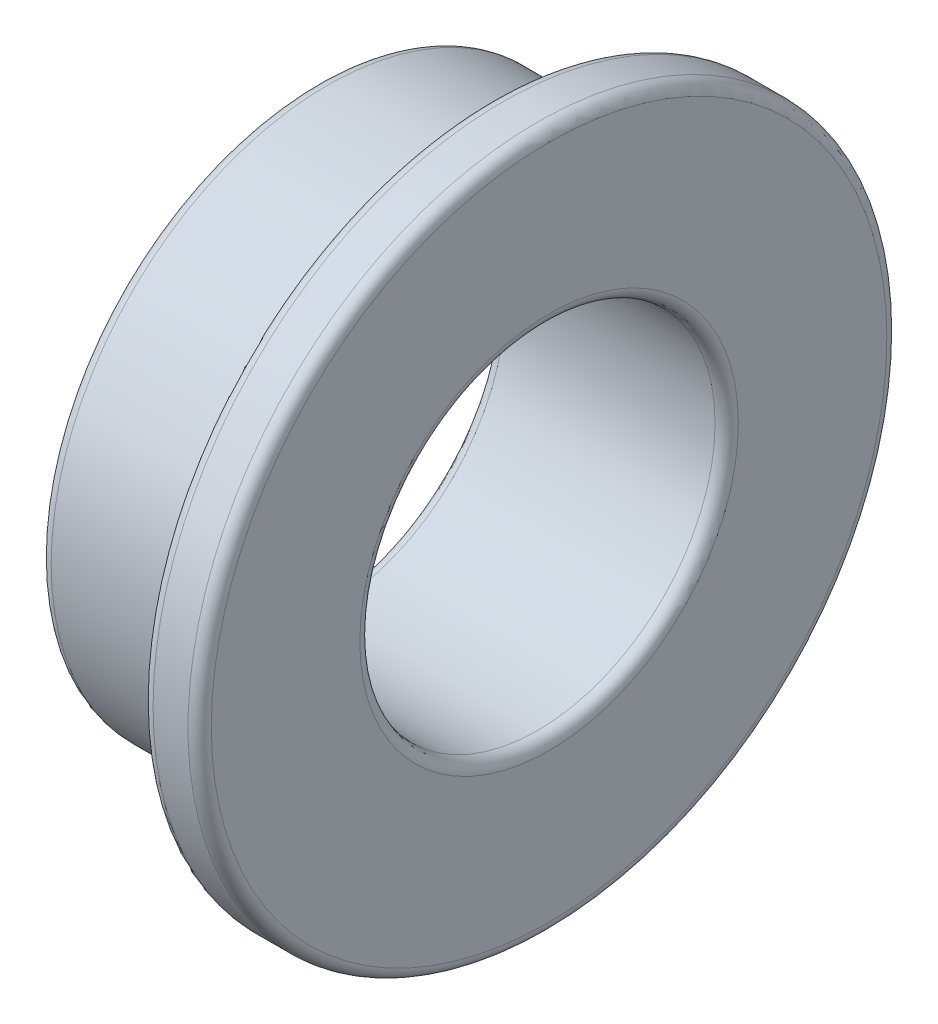
ISO-10303-21;
HEADER;
FILE_DESCRIPTION(('STEP AP214'),'2;1');
FILE_NAME('part.step','',(''),(''),'','','');
FILE_SCHEMA(('AUTOMOTIVE_DESIGN { 1 0 10303 214 1 1 1 1 }'));
ENDSEC;
DATA;
#1=APPLICATION_CONTEXT('core data for automotive mechanical design processes');
#2=APPLICATION_PROTOCOL_DEFINITION('international standard','automotive_design',2000,#1);
#3=PRODUCT_CONTEXT('',#1,'mechanical');
#4=PRODUCT('Part','Part','',(#3));
#5=PRODUCT_RELATED_PRODUCT_CATEGORY('part','',(#4));
#6=PRODUCT_DEFINITION_FORMATION('','',#4);
#7=PRODUCT_DEFINITION_CONTEXT('part definition',#1,'design');
#8=PRODUCT_DEFINITION('design','',#6,#7);
#9=PRODUCT_DEFINITION_SHAPE('','',#8);
#10=(LENGTH_UNIT() NAMED_UNIT(*) SI_UNIT(.MILLI.,.METRE.));
#11=(NAMED_UNIT(*) PLANE_ANGLE_UNIT() SI_UNIT($,.RADIAN.));
#12=(NAMED_UNIT(*) SI_UNIT($,.STERADIAN.) SOLID_ANGLE_UNIT());
#13=UNCERTAINTY_MEASURE_WITH_UNIT(LENGTH_MEASURE(1.E-05),#10,'distance_accuracy_value','');
#14=(GEOMETRIC_REPRESENTATION_CONTEXT(3) GLOBAL_UNCERTAINTY_ASSIGNED_CONTEXT((#13)) GLOBAL_UNIT_ASSIGNED_CONTEXT((#10,
#11,#12)) REPRESENTATION_CONTEXT('',''));
#15=CARTESIAN_POINT('',(0.,0.,0.));
#16=DIRECTION('',(0.,0.,1.));
#17=DIRECTION('',(1.,0.,0.));
#18=AXIS2_PLACEMENT_3D('',#15,#16,#17);
#19=CARTESIAN_POINT('',(-4.,0.,0.));
#20=DIRECTION('',(-1.,0.,0.));
#21=DIRECTION('',(0.,0.,1.));
#22=AXIS2_PLACEMENT_3D('',#19,#20,#21);
#23=PLANE('',#22);
#24=CARTESIAN_POINT('',(-4.,0.,0.));
#25=DIRECTION('',(-1.,0.,0.));
#26=DIRECTION('',(0.,0.,1.));
#27=AXIS2_PLACEMENT_3D('',#24,#25,#26);
#28=CIRCLE('',#27,3.25);
#29=CARTESIAN_POINT('',(-4.,0.,3.25));
#30=VERTEX_POINT('',#29);
#31=EDGE_CURVE('E69',#30,#30,#28,.F.);
#32=ORIENTED_EDGE('',*,*,#31,.T.);
#33=EDGE_LOOP('',(#32));
#34=FACE_BOUND('',#33,.T.);
#35=CARTESIAN_POINT('',(-4.,0.,0.));
#36=DIRECTION('',(-1.,0.,0.));
#37=DIRECTION('',(0.,0.,1.));
#38=AXIS2_PLACEMENT_3D('',#35,#36,#37);
#39=CIRCLE('',#38,4.55);
#40=CARTESIAN_POINT('',(-4.,0.,4.55));
#41=VERTEX_POINT('',#40);
#42=EDGE_CURVE('E73',#41,#41,#39,.T.);
#43=ORIENTED_EDGE('',*,*,#42,.T.);
#44=EDGE_LOOP('',(#43));
#45=FACE_BOUND('',#44,.T.);
#46=ADVANCED_FACE('F37',(#34,#45),#23,.T.);
#47=CARTESIAN_POINT('',(0.,0.,0.));
#48=DIRECTION('',(1.,0.,0.));
#49=DIRECTION('',(0.,0.,-1.));
#50=AXIS2_PLACEMENT_3D('',#47,#48,#49);
#51=CYLINDRICAL_SURFACE('',#50,4.75);
#52=CARTESIAN_POINT('',(-1.2,0.,0.));
#53=DIRECTION('',(-1.,0.,0.));
#54=DIRECTION('',(0.,0.,1.));
#55=AXIS2_PLACEMENT_3D('',#52,#53,#54);
#56=CIRCLE('',#55,4.75);
#57=CARTESIAN_POINT('',(-1.2,0.,4.75));
#58=VERTEX_POINT('',#57);
#59=EDGE_CURVE('E10',#58,#58,#56,.T.);
#60=ORIENTED_EDGE('',*,*,#59,.T.);
#61=EDGE_LOOP('',(#60));
#62=FACE_BOUND('',#61,.T.);
#63=CARTESIAN_POINT('',(-3.8,0.,0.));
#64=DIRECTION('',(-1.,0.,0.));
#65=DIRECTION('',(0.,0.,1.));
#66=AXIS2_PLACEMENT_3D('',#63,#64,#65);
#67=CIRCLE('',#66,4.75);
#68=CARTESIAN_POINT('',(-3.8,0.,4.75));
#69=VERTEX_POINT('',#68);
#70=EDGE_CURVE('E45',#69,#69,#67,.F.);
#71=ORIENTED_EDGE('',*,*,#70,.T.);
#72=EDGE_LOOP('',(#71));
#73=FACE_BOUND('',#72,.T.);
#74=ADVANCED_FACE('F106',(#62,#73),#51,.T.);
#75=CARTESIAN_POINT('',(-1.,4.75,0.));
#76=DIRECTION('',(-1.,0.,0.));
#77=DIRECTION('',(0.,0.,1.));
#78=AXIS2_PLACEMENT_3D('',#75,#76,#77);
#79=PLANE('',#78);
#80=CARTESIAN_POINT('',(-1.,0.,0.));
#81=DIRECTION('',(-1.,0.,0.));
#82=DIRECTION('',(0.,0.,1.));
#83=AXIS2_PLACEMENT_3D('',#80,#81,#82);
#84=CIRCLE('',#83,5.8);
#85=CARTESIAN_POINT('',(-1.,0.,5.8));
#86=VERTEX_POINT('',#85);
#87=EDGE_CURVE('E50',#86,#86,#84,.T.);
#88=ORIENTED_EDGE('',*,*,#87,.T.);
#89=EDGE_LOOP('',(#88));
#90=FACE_BOUND('',#89,.T.);
#91=CARTESIAN_POINT('',(-1.,0.,0.));
#92=DIRECTION('',(-1.,0.,0.));
#93=DIRECTION('',(0.,0.,1.));
#94=AXIS2_PLACEMENT_3D('',#91,#92,#93);
#95=CIRCLE('',#94,4.95);
#96=CARTESIAN_POINT('',(-1.,0.,4.95));
#97=VERTEX_POINT('',#96);
#98=EDGE_CURVE('E55',#97,#97,#95,.F.);
#99=ORIENTED_EDGE('',*,*,#98,.T.);
#100=EDGE_LOOP('',(#99));
#101=FACE_BOUND('',#100,.T.);
#102=ADVANCED_FACE('F133',(#90,#101),#79,.T.);
#103=CARTESIAN_POINT('',(0.,0.,0.));
#104=DIRECTION('',(1.,0.,0.));
#105=DIRECTION('',(0.,0.,-1.));
#106=AXIS2_PLACEMENT_3D('',#103,#104,#105);
#107=CYLINDRICAL_SURFACE('',#106,6.);
#108=CARTESIAN_POINT('',(-0.2,0.,0.));
#109=DIRECTION('',(1.,0.,0.));
#110=DIRECTION('',(0.,0.,-1.));
#111=AXIS2_PLACEMENT_3D('',#108,#109,#110);
#112=CIRCLE('',#111,6.);
#113=CARTESIAN_POINT('',(-0.2,0.,-6.));
#114=VERTEX_POINT('',#113);
#115=EDGE_CURVE('E61',#114,#114,#112,.F.);
#116=ORIENTED_EDGE('',*,*,#115,.T.);
#117=EDGE_LOOP('',(#116));
#118=FACE_BOUND('',#117,.T.);
#119=CARTESIAN_POINT('',(-0.8,0.,0.));
#120=DIRECTION('',(-1.,0.,0.));
#121=DIRECTION('',(0.,0.,1.));
#122=AXIS2_PLACEMENT_3D('',#119,#120,#121);
#123=CIRCLE('',#122,6.);
#124=CARTESIAN_POINT('',(-0.8,0.,6.));
#125=VERTEX_POINT('',#124);
#126=EDGE_CURVE('E65',#125,#125,#123,.F.);
#127=ORIENTED_EDGE('',*,*,#126,.T.);
#128=EDGE_LOOP('',(#127));
#129=FACE_BOUND('',#128,.T.);
#130=ADVANCED_FACE('F136',(#118,#129),#107,.T.);
#131=CARTESIAN_POINT('',(0.,6.,0.));
#132=DIRECTION('',(1.,0.,0.));
#133=DIRECTION('',(0.,0.,-1.));
#134=AXIS2_PLACEMENT_3D('',#131,#132,#133);
#135=PLANE('',#134);
#136=CARTESIAN_POINT('',(0.,0.,0.));
#137=DIRECTION('',(1.,0.,0.));
#138=DIRECTION('',(0.,0.,-1.));
#139=AXIS2_PLACEMENT_3D('',#136,#137,#138);
#140=CIRCLE('',#139,3.25);
#141=CARTESIAN_POINT('',(0.,0.,-3.25));
#142=VERTEX_POINT('',#141);
#143=EDGE_CURVE('E77',#142,#142,#140,.F.);
#144=ORIENTED_EDGE('',*,*,#143,.T.);
#145=EDGE_LOOP('',(#144));
#146=FACE_BOUND('',#145,.T.);
#147=CARTESIAN_POINT('',(0.,0.,0.));
#148=DIRECTION('',(1.,0.,0.));
#149=DIRECTION('',(0.,0.,-1.));
#150=AXIS2_PLACEMENT_3D('',#147,#148,#149);
#151=CIRCLE('',#150,5.8);
#152=CARTESIAN_POINT('',(0.,0.,-5.8));
#153=VERTEX_POINT('',#152);
#154=EDGE_CURVE('E81',#153,#153,#151,.T.);
#155=ORIENTED_EDGE('',*,*,#154,.T.);
#156=EDGE_LOOP('',(#155));
#157=FACE_BOUND('',#156,.T.);
#158=ADVANCED_FACE('F140',(#146,#157),#135,.T.);
#159=CARTESIAN_POINT('',(-4.001,0.,0.));
#160=DIRECTION('',(1.,0.,0.));
#161=DIRECTION('',(0.,0.,-1.));
#162=AXIS2_PLACEMENT_3D('',#159,#160,#161);
#163=CYLINDRICAL_SURFACE('',#162,3.05);
#164=CARTESIAN_POINT('',(-0.200000000000001,0.,0.));
#165=DIRECTION('',(1.,0.,0.));
#166=DIRECTION('',(0.,0.,-1.));
#167=AXIS2_PLACEMENT_3D('',#164,#165,#166);
#168=CIRCLE('',#167,3.05);
#169=CARTESIAN_POINT('',(-0.200000000000001,0.,-3.05));
#170=VERTEX_POINT('',#169);
#171=EDGE_CURVE('E85',#170,#170,#168,.T.);
#172=ORIENTED_EDGE('',*,*,#171,.T.);
#173=EDGE_LOOP('',(#172));
#174=FACE_BOUND('',#173,.T.);
#175=CARTESIAN_POINT('',(-3.8,0.,0.));
#176=DIRECTION('',(-1.,0.,0.));
#177=DIRECTION('',(0.,0.,1.));
#178=AXIS2_PLACEMENT_3D('',#175,#176,#177);
#179=CIRCLE('',#178,3.05);
#180=CARTESIAN_POINT('',(-3.8,0.,3.05));
#181=VERTEX_POINT('',#180);
#182=EDGE_CURVE('E89',#181,#181,#179,.T.);
#183=ORIENTED_EDGE('',*,*,#182,.T.);
#184=EDGE_LOOP('',(#183));
#185=FACE_BOUND('',#184,.T.);
#186=ADVANCED_FACE('F94',(#174,#185),#163,.F.);
#187=CARTESIAN_POINT('',(-0.200000000000001,0.,0.));
#188=DIRECTION('',(1.,0.,0.));
#189=DIRECTION('',(0.,0.,-1.));
#190=AXIS2_PLACEMENT_3D('',#187,#188,#189);
#191=TOROIDAL_SURFACE('',#190,3.25,0.2);
#192=ORIENTED_EDGE('',*,*,#143,.F.);
#193=EDGE_LOOP('',(#192));
#194=FACE_BOUND('',#193,.T.);
#195=ORIENTED_EDGE('',*,*,#171,.F.);
#196=EDGE_LOOP('',(#195));
#197=FACE_BOUND('',#196,.T.);
#198=ADVANCED_FACE('F100',(#194,#197),#191,.T.);
#199=CARTESIAN_POINT('',(-3.8,0.,0.));
#200=DIRECTION('',(-1.,0.,0.));
#201=DIRECTION('',(0.,0.,1.));
#202=AXIS2_PLACEMENT_3D('',#199,#200,#201);
#203=TOROIDAL_SURFACE('',#202,3.25,0.2);
#204=ORIENTED_EDGE('',*,*,#182,.F.);
#205=EDGE_LOOP('',(#204));
#206=FACE_BOUND('',#205,.T.);
#207=ORIENTED_EDGE('',*,*,#31,.F.);
#208=EDGE_LOOP('',(#207));
#209=FACE_BOUND('',#208,.T.);
#210=ADVANCED_FACE('F96',(#206,#209),#203,.T.);
#211=CARTESIAN_POINT('',(-0.2,0.,0.));
#212=DIRECTION('',(1.,0.,0.));
#213=DIRECTION('',(0.,0.,-1.));
#214=AXIS2_PLACEMENT_3D('',#211,#212,#213);
#215=TOROIDAL_SURFACE('',#214,5.8,0.2);
#216=ORIENTED_EDGE('',*,*,#115,.F.);
#217=EDGE_LOOP('',(#216));
#218=FACE_BOUND('',#217,.T.);
#219=ORIENTED_EDGE('',*,*,#154,.F.);
#220=EDGE_LOOP('',(#219));
#221=FACE_BOUND('',#220,.T.);
#222=ADVANCED_FACE('F99',(#218,#221),#215,.T.);
#223=CARTESIAN_POINT('',(-0.8,0.,0.));
#224=DIRECTION('',(-1.,0.,0.));
#225=DIRECTION('',(0.,0.,1.));
#226=AXIS2_PLACEMENT_3D('',#223,#224,#225);
#227=TOROIDAL_SURFACE('',#226,5.8,0.2);
#228=ORIENTED_EDGE('',*,*,#87,.F.);
#229=EDGE_LOOP('',(#228));
#230=FACE_BOUND('',#229,.T.);
#231=ORIENTED_EDGE('',*,*,#126,.F.);
#232=EDGE_LOOP('',(#231));
#233=FACE_BOUND('',#232,.T.);
#234=ADVANCED_FACE('F116',(#230,#233),#227,.T.);
#235=CARTESIAN_POINT('',(-1.2,0.,0.));
#236=DIRECTION('',(-1.,0.,0.));
#237=DIRECTION('',(0.,0.,1.));
#238=AXIS2_PLACEMENT_3D('',#235,#236,#237);
#239=TOROIDAL_SURFACE('',#238,4.95,0.2);
#240=ORIENTED_EDGE('',*,*,#59,.F.);
#241=EDGE_LOOP('',(#240));
#242=FACE_BOUND('',#241,.T.);
#243=ORIENTED_EDGE('',*,*,#98,.F.);
#244=EDGE_LOOP('',(#243));
#245=FACE_BOUND('',#244,.T.);
#246=ADVANCED_FACE('F112',(#242,#245),#239,.F.);
#247=CARTESIAN_POINT('',(-3.8,0.,0.));
#248=DIRECTION('',(-1.,0.,0.));
#249=DIRECTION('',(0.,0.,1.));
#250=AXIS2_PLACEMENT_3D('',#247,#248,#249);
#251=TOROIDAL_SURFACE('',#250,4.55,0.2);
#252=ORIENTED_EDGE('',*,*,#42,.F.);
#253=EDGE_LOOP('',(#252));
#254=FACE_BOUND('',#253,.T.);
#255=ORIENTED_EDGE('',*,*,#70,.F.);
#256=EDGE_LOOP('',(#255));
#257=FACE_BOUND('',#256,.T.);
#258=ADVANCED_FACE('F39',(#254,#257),#251,.T.);
#259=CLOSED_SHELL('',(#46,#74,#102,#130,#158,#186,#198,#210,#222,#234,#246,#258));
#260=MANIFOLD_SOLID_BREP('B2',#259);
#261=ADVANCED_BREP_SHAPE_REPRESENTATION('',(#18,#260),#14);
#262=SHAPE_DEFINITION_REPRESENTATION(#9,#261);
ENDSEC;
END-ISO-10303-21;
